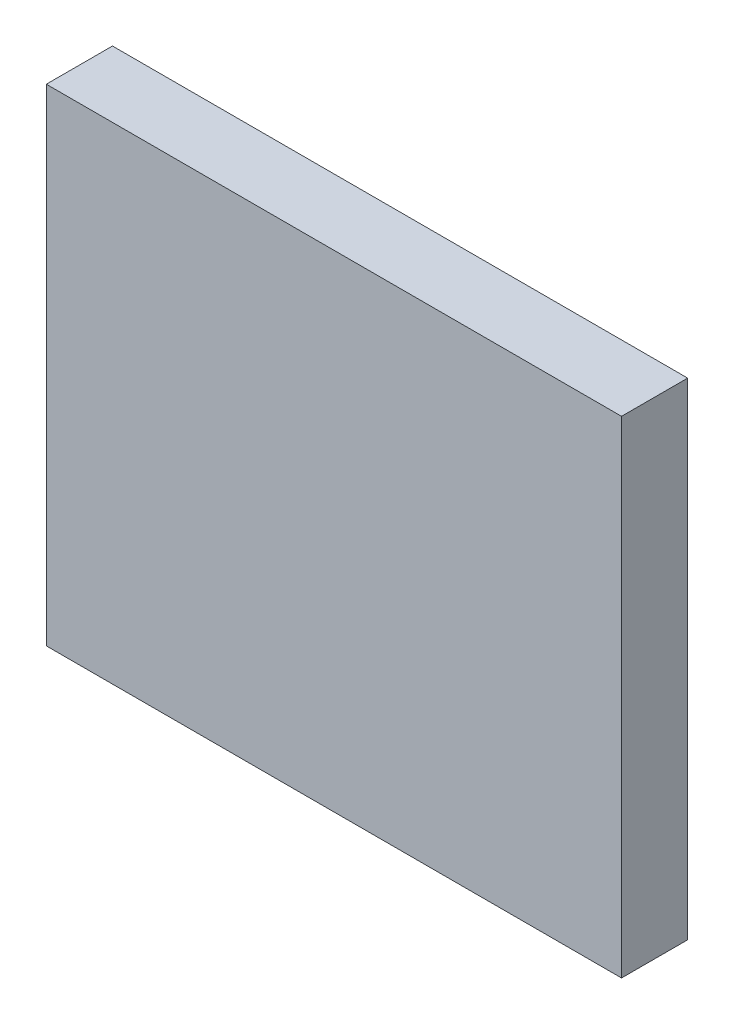
ISO-10303-21;
HEADER;
FILE_DESCRIPTION(('STEP AP214'),'2;1');
FILE_NAME('part.step','',(''),(''),'','','');
FILE_SCHEMA(('AUTOMOTIVE_DESIGN { 1 0 10303 214 1 1 1 1 }'));
ENDSEC;
DATA;
#1=APPLICATION_CONTEXT('core data for automotive mechanical design processes');
#2=APPLICATION_PROTOCOL_DEFINITION('international standard','automotive_design',2000,#1);
#3=PRODUCT_CONTEXT('',#1,'mechanical');
#4=PRODUCT('Part','Part','',(#3));
#5=PRODUCT_RELATED_PRODUCT_CATEGORY('part','',(#4));
#6=PRODUCT_DEFINITION_FORMATION('','',#4);
#7=PRODUCT_DEFINITION_CONTEXT('part definition',#1,'design');
#8=PRODUCT_DEFINITION('design','',#6,#7);
#9=PRODUCT_DEFINITION_SHAPE('','',#8);
#10=(LENGTH_UNIT() NAMED_UNIT(*) SI_UNIT(.MILLI.,.METRE.));
#11=(NAMED_UNIT(*) PLANE_ANGLE_UNIT() SI_UNIT($,.RADIAN.));
#12=(NAMED_UNIT(*) SI_UNIT($,.STERADIAN.) SOLID_ANGLE_UNIT());
#13=UNCERTAINTY_MEASURE_WITH_UNIT(LENGTH_MEASURE(1.E-05),#10,'distance_accuracy_value','');
#14=(GEOMETRIC_REPRESENTATION_CONTEXT(3) GLOBAL_UNCERTAINTY_ASSIGNED_CONTEXT((#13)) GLOBAL_UNIT_ASSIGNED_CONTEXT((#10,
#11,#12)) REPRESENTATION_CONTEXT('',''));
#15=CARTESIAN_POINT('',(0.,0.,0.));
#16=DIRECTION('',(0.,0.,1.));
#17=DIRECTION('',(1.,0.,0.));
#18=AXIS2_PLACEMENT_3D('',#15,#16,#17);
#19=CARTESIAN_POINT('',(-4.34715,3.75,1.));
#20=DIRECTION('',(1.,0.,0.));
#21=DIRECTION('',(0.,0.,-1.));
#22=AXIS2_PLACEMENT_3D('',#19,#20,#21);
#23=PLANE('',#22);
#24=DIRECTION('',(0.,-1.,0.));
#25=VECTOR('',#24,1.);
#26=CARTESIAN_POINT('',(-4.34715,3.75,0.));
#27=LINE('',#26,#25);
#28=CARTESIAN_POINT('',(-4.34715,3.75,0.));
#29=VERTEX_POINT('',#28);
#30=CARTESIAN_POINT('',(-4.34715,-3.6025,0.));
#31=VERTEX_POINT('',#30);
#32=EDGE_CURVE('E99',#29,#31,#27,.T.);
#33=ORIENTED_EDGE('',*,*,#32,.T.);
#34=DIRECTION('',(0.,0.,-1.));
#35=VECTOR('',#34,1.);
#36=CARTESIAN_POINT('',(-4.34715,-3.6025,1.));
#37=LINE('',#36,#35);
#38=CARTESIAN_POINT('',(-4.34715,-3.6025,1.));
#39=VERTEX_POINT('',#38);
#40=EDGE_CURVE('E11',#39,#31,#37,.T.);
#41=ORIENTED_EDGE('',*,*,#40,.F.);
#42=DIRECTION('',(0.,-1.,0.));
#43=VECTOR('',#42,1.);
#44=CARTESIAN_POINT('',(-4.34715,3.75,1.));
#45=LINE('',#44,#43);
#46=CARTESIAN_POINT('',(-4.34715,3.75,1.));
#47=VERTEX_POINT('',#46);
#48=EDGE_CURVE('E87',#47,#39,#45,.T.);
#49=ORIENTED_EDGE('',*,*,#48,.F.);
#50=DIRECTION('',(0.,0.,-1.));
#51=VECTOR('',#50,1.);
#52=CARTESIAN_POINT('',(-4.34715,3.75,1.));
#53=LINE('',#52,#51);
#54=EDGE_CURVE('E95',#47,#29,#53,.T.);
#55=ORIENTED_EDGE('',*,*,#54,.T.);
#56=EDGE_LOOP('',(#33,#41,#49,#55));
#57=FACE_BOUND('',#56,.T.);
#58=ADVANCED_FACE('F36',(#57),#23,.F.);
#59=CARTESIAN_POINT('',(-4.34715,-3.6025,1.));
#60=DIRECTION('',(0.,1.,0.));
#61=DIRECTION('',(0.,0.,1.));
#62=AXIS2_PLACEMENT_3D('',#59,#60,#61);
#63=PLANE('',#62);
#64=DIRECTION('',(1.,0.,0.));
#65=VECTOR('',#64,1.);
#66=CARTESIAN_POINT('',(-4.34715,-3.6025,0.));
#67=LINE('',#66,#65);
#68=CARTESIAN_POINT('',(4.34715,-3.6025,0.));
#69=VERTEX_POINT('',#68);
#70=EDGE_CURVE('E91',#31,#69,#67,.T.);
#71=ORIENTED_EDGE('',*,*,#70,.T.);
#72=DIRECTION('',(0.,0.,-1.));
#73=VECTOR('',#72,1.);
#74=CARTESIAN_POINT('',(4.34715,-3.6025,1.));
#75=LINE('',#74,#73);
#76=CARTESIAN_POINT('',(4.34715,-3.6025,1.));
#77=VERTEX_POINT('',#76);
#78=EDGE_CURVE('E44',#77,#69,#75,.T.);
#79=ORIENTED_EDGE('',*,*,#78,.F.);
#80=DIRECTION('',(1.,0.,0.));
#81=VECTOR('',#80,1.);
#82=CARTESIAN_POINT('',(-4.34715,-3.6025,1.));
#83=LINE('',#82,#81);
#84=EDGE_CURVE('E82',#39,#77,#83,.T.);
#85=ORIENTED_EDGE('',*,*,#84,.F.);
#86=ORIENTED_EDGE('',*,*,#40,.T.);
#87=EDGE_LOOP('',(#71,#79,#85,#86));
#88=FACE_BOUND('',#87,.T.);
#89=ADVANCED_FACE('F90',(#88),#63,.F.);
#90=CARTESIAN_POINT('',(4.34715,-3.6025,1.));
#91=DIRECTION('',(-1.,0.,0.));
#92=DIRECTION('',(0.,0.,1.));
#93=AXIS2_PLACEMENT_3D('',#90,#91,#92);
#94=PLANE('',#93);
#95=DIRECTION('',(0.,1.,0.));
#96=VECTOR('',#95,1.);
#97=CARTESIAN_POINT('',(4.34715,-3.6025,0.));
#98=LINE('',#97,#96);
#99=CARTESIAN_POINT('',(4.34715,3.75,0.));
#100=VERTEX_POINT('',#99);
#101=EDGE_CURVE('E69',#69,#100,#98,.T.);
#102=ORIENTED_EDGE('',*,*,#101,.T.);
#103=DIRECTION('',(0.,0.,-1.));
#104=VECTOR('',#103,1.);
#105=CARTESIAN_POINT('',(4.34715,3.75,1.));
#106=LINE('',#105,#104);
#107=CARTESIAN_POINT('',(4.34715,3.75,1.));
#108=VERTEX_POINT('',#107);
#109=EDGE_CURVE('E92',#108,#100,#106,.T.);
#110=ORIENTED_EDGE('',*,*,#109,.F.);
#111=DIRECTION('',(0.,1.,0.));
#112=VECTOR('',#111,1.);
#113=CARTESIAN_POINT('',(4.34715,-3.6025,1.));
#114=LINE('',#113,#112);
#115=EDGE_CURVE('E85',#77,#108,#114,.T.);
#116=ORIENTED_EDGE('',*,*,#115,.F.);
#117=ORIENTED_EDGE('',*,*,#78,.T.);
#118=EDGE_LOOP('',(#102,#110,#116,#117));
#119=FACE_BOUND('',#118,.T.);
#120=ADVANCED_FACE('F93',(#119),#94,.F.);
#121=CARTESIAN_POINT('',(4.34715,3.75,1.));
#122=DIRECTION('',(0.,-1.,0.));
#123=DIRECTION('',(0.,0.,-1.));
#124=AXIS2_PLACEMENT_3D('',#121,#122,#123);
#125=PLANE('',#124);
#126=DIRECTION('',(-1.,0.,0.));
#127=VECTOR('',#126,1.);
#128=CARTESIAN_POINT('',(4.34715,3.75,0.));
#129=LINE('',#128,#127);
#130=EDGE_CURVE('E75',#100,#29,#129,.T.);
#131=ORIENTED_EDGE('',*,*,#130,.T.);
#132=ORIENTED_EDGE('',*,*,#54,.F.);
#133=DIRECTION('',(-1.,0.,0.));
#134=VECTOR('',#133,1.);
#135=CARTESIAN_POINT('',(4.34715,3.75,1.));
#136=LINE('',#135,#134);
#137=EDGE_CURVE('E52',#108,#47,#136,.T.);
#138=ORIENTED_EDGE('',*,*,#137,.F.);
#139=ORIENTED_EDGE('',*,*,#109,.T.);
#140=EDGE_LOOP('',(#131,#132,#138,#139));
#141=FACE_BOUND('',#140,.T.);
#142=ADVANCED_FACE('F106',(#141),#125,.F.);
#143=CARTESIAN_POINT('',(0.,0.,1.));
#144=DIRECTION('',(0.,0.,1.));
#145=DIRECTION('',(1.,0.,0.));
#146=AXIS2_PLACEMENT_3D('',#143,#144,#145);
#147=PLANE('',#146);
#148=ORIENTED_EDGE('',*,*,#48,.T.);
#149=ORIENTED_EDGE('',*,*,#84,.T.);
#150=ORIENTED_EDGE('',*,*,#115,.T.);
#151=ORIENTED_EDGE('',*,*,#137,.T.);
#152=EDGE_LOOP('',(#148,#149,#150,#151));
#153=FACE_BOUND('',#152,.T.);
#154=ADVANCED_FACE('F83',(#153),#147,.T.);
#155=CARTESIAN_POINT('',(0.,0.,0.));
#156=DIRECTION('',(0.,0.,1.));
#157=DIRECTION('',(1.,0.,0.));
#158=AXIS2_PLACEMENT_3D('',#155,#156,#157);
#159=PLANE('',#158);
#160=ORIENTED_EDGE('',*,*,#32,.F.);
#161=ORIENTED_EDGE('',*,*,#130,.F.);
#162=ORIENTED_EDGE('',*,*,#101,.F.);
#163=ORIENTED_EDGE('',*,*,#70,.F.);
#164=EDGE_LOOP('',(#160,#161,#162,#163));
#165=FACE_BOUND('',#164,.T.);
#166=ADVANCED_FACE('F109',(#165),#159,.F.);
#167=CLOSED_SHELL('',(#58,#89,#120,#142,#154,#166));
#168=MANIFOLD_SOLID_BREP('B2',#167);
#169=ADVANCED_BREP_SHAPE_REPRESENTATION('',(#18,#168),#14);
#170=SHAPE_DEFINITION_REPRESENTATION(#9,#169);
ENDSEC;
END-ISO-10303-21;
